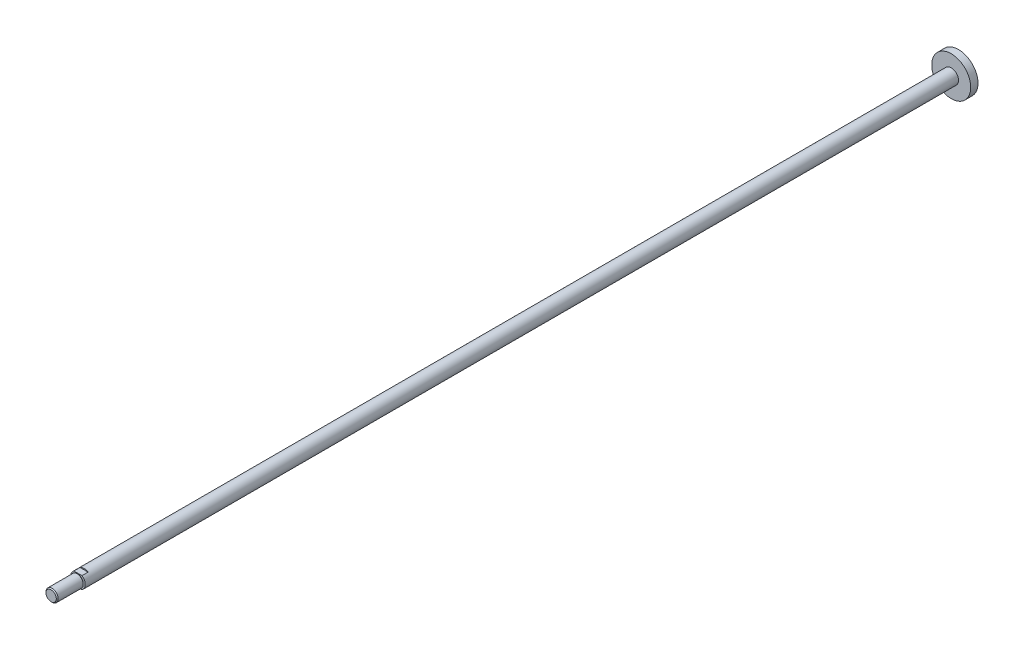
ISO-10303-21;
HEADER;
FILE_DESCRIPTION(('STEP AP214'),'2;1');
FILE_NAME('part.step','',(''),(''),'','','');
FILE_SCHEMA(('AUTOMOTIVE_DESIGN { 1 0 10303 214 1 1 1 1 }'));
ENDSEC;
DATA;
#1=APPLICATION_CONTEXT('core data for automotive mechanical design processes');
#2=APPLICATION_PROTOCOL_DEFINITION('international standard','automotive_design',2000,#1);
#3=PRODUCT_CONTEXT('',#1,'mechanical');
#4=PRODUCT('Part','Part','',(#3));
#5=PRODUCT_RELATED_PRODUCT_CATEGORY('part','',(#4));
#6=PRODUCT_DEFINITION_FORMATION('','',#4);
#7=PRODUCT_DEFINITION_CONTEXT('part definition',#1,'design');
#8=PRODUCT_DEFINITION('design','',#6,#7);
#9=PRODUCT_DEFINITION_SHAPE('','',#8);
#10=(LENGTH_UNIT() NAMED_UNIT(*) SI_UNIT(.MILLI.,.METRE.));
#11=(NAMED_UNIT(*) PLANE_ANGLE_UNIT() SI_UNIT($,.RADIAN.));
#12=(NAMED_UNIT(*) SI_UNIT($,.STERADIAN.) SOLID_ANGLE_UNIT());
#13=UNCERTAINTY_MEASURE_WITH_UNIT(LENGTH_MEASURE(1.E-05),#10,'distance_accuracy_value','');
#14=(GEOMETRIC_REPRESENTATION_CONTEXT(3) GLOBAL_UNCERTAINTY_ASSIGNED_CONTEXT((#13)) GLOBAL_UNIT_ASSIGNED_CONTEXT((#10,
#11,#12)) REPRESENTATION_CONTEXT('',''));
#15=CARTESIAN_POINT('',(0.,0.,0.));
#16=DIRECTION('',(0.,0.,1.));
#17=DIRECTION('',(1.,0.,0.));
#18=AXIS2_PLACEMENT_3D('',#15,#16,#17);
#19=CARTESIAN_POINT('',(0.,0.,745.));
#20=DIRECTION('',(0.,0.,-1.));
#21=DIRECTION('',(-1.,0.,0.));
#22=AXIS2_PLACEMENT_3D('',#19,#20,#21);
#23=PLANE('',#22);
#24=CARTESIAN_POINT('',(0.,0.,745.000000000005));
#25=DIRECTION('',(0.,0.,-1.));
#26=DIRECTION('',(-1.,0.,0.));
#27=AXIS2_PLACEMENT_3D('',#24,#25,#26);
#28=CIRCLE('',#27,4.23299999999927);
#29=CARTESIAN_POINT('',(-4.23299999999927,0.,745.000000000005));
#30=VERTEX_POINT('',#29);
#31=EDGE_CURVE('E20',#30,#30,#28,.T.);
#32=ORIENTED_EDGE('',*,*,#31,.F.);
#33=EDGE_LOOP('',(#32));
#34=FACE_BOUND('',#33,.T.);
#35=ADVANCED_FACE('F17',(#34),#23,.F.);
#36=CARTESIAN_POINT('',(0.,0.,744.233000000008));
#37=DIRECTION('',(0.,0.,-1.));
#38=DIRECTION('',(-1.,0.,0.));
#39=AXIS2_PLACEMENT_3D('',#36,#37,#38);
#40=CONICAL_SURFACE('',#39,4.99999999999545,0.785398163397448);
#41=ORIENTED_EDGE('',*,*,#31,.T.);
#42=EDGE_LOOP('',(#41));
#43=FACE_BOUND('',#42,.T.);
#44=CARTESIAN_POINT('',(0.,0.,744.233));
#45=DIRECTION('',(0.,0.,1.));
#46=DIRECTION('',(1.,0.,0.));
#47=AXIS2_PLACEMENT_3D('',#44,#45,#46);
#48=CIRCLE('',#47,5.);
#49=CARTESIAN_POINT('',(5.,0.,744.233));
#50=VERTEX_POINT('',#49);
#51=EDGE_CURVE('E98',#50,#50,#48,.F.);
#52=ORIENTED_EDGE('',*,*,#51,.F.);
#53=EDGE_LOOP('',(#52));
#54=FACE_BOUND('',#53,.T.);
#55=ADVANCED_FACE('F221',(#43,#54),#40,.T.);
#56=CARTESIAN_POINT('',(0.,16.,0.));
#57=DIRECTION('',(0.,0.,1.));
#58=DIRECTION('',(1.,0.,0.));
#59=AXIS2_PLACEMENT_3D('',#56,#57,#58);
#60=PLANE('',#59);
#61=CARTESIAN_POINT('',(0.,0.,0.));
#62=DIRECTION('',(0.,0.,1.));
#63=DIRECTION('',(1.,0.,0.));
#64=AXIS2_PLACEMENT_3D('',#61,#62,#63);
#65=CIRCLE('',#64,16.);
#66=CARTESIAN_POINT('',(16.,0.,0.));
#67=VERTEX_POINT('',#66);
#68=EDGE_CURVE('E96',#67,#67,#65,.T.);
#69=ORIENTED_EDGE('',*,*,#68,.F.);
#70=EDGE_LOOP('',(#69));
#71=FACE_BOUND('',#70,.T.);
#72=ADVANCED_FACE('F212',(#71),#60,.F.);
#73=CARTESIAN_POINT('',(0.,0.,722.9));
#74=DIRECTION('',(0.,0.,1.));
#75=DIRECTION('',(1.,0.,0.));
#76=AXIS2_PLACEMENT_3D('',#73,#74,#75);
#77=CYLINDRICAL_SURFACE('',#76,5.);
#78=ORIENTED_EDGE('',*,*,#51,.T.);
#79=EDGE_LOOP('',(#78));
#80=FACE_BOUND('',#79,.T.);
#81=CARTESIAN_POINT('',(0.,0.,723.666999999921));
#82=DIRECTION('',(0.,0.,1.));
#83=DIRECTION('',(1.,0.,0.));
#84=AXIS2_PLACEMENT_3D('',#81,#82,#83);
#85=CIRCLE('',#84,4.99999999999545);
#86=CARTESIAN_POINT('',(4.99999999999545,0.,723.666999999921));
#87=VERTEX_POINT('',#86);
#88=EDGE_CURVE('E95',#87,#87,#85,.F.);
#89=ORIENTED_EDGE('',*,*,#88,.F.);
#90=EDGE_LOOP('',(#89));
#91=FACE_BOUND('',#90,.T.);
#92=ADVANCED_FACE('F202',(#80,#91),#77,.T.);
#93=CARTESIAN_POINT('',(0.,0.,0.));
#94=DIRECTION('',(0.,0.,1.));
#95=DIRECTION('',(1.,0.,0.));
#96=AXIS2_PLACEMENT_3D('',#93,#94,#95);
#97=CYLINDRICAL_SURFACE('',#96,16.);
#98=CARTESIAN_POINT('',(0.,0.,6.));
#99=DIRECTION('',(0.,0.,1.));
#100=DIRECTION('',(1.,0.,0.));
#101=AXIS2_PLACEMENT_3D('',#98,#99,#100);
#102=CIRCLE('',#101,16.);
#103=CARTESIAN_POINT('',(16.,0.,6.));
#104=VERTEX_POINT('',#103);
#105=EDGE_CURVE('E93',#104,#104,#102,.F.);
#106=ORIENTED_EDGE('',*,*,#105,.T.);
#107=EDGE_LOOP('',(#106));
#108=FACE_BOUND('',#107,.T.);
#109=ORIENTED_EDGE('',*,*,#68,.T.);
#110=EDGE_LOOP('',(#109));
#111=FACE_BOUND('',#110,.T.);
#112=ADVANCED_FACE('F192',(#108,#111),#97,.T.);
#113=CARTESIAN_POINT('',(0.,0.,723.666999999864));
#114=DIRECTION('',(0.,0.,1.));
#115=DIRECTION('',(1.,0.,0.));
#116=AXIS2_PLACEMENT_3D('',#113,#114,#115);
#117=CONICAL_SURFACE('',#116,4.99999999993861,0.785398163397448);
#118=ORIENTED_EDGE('',*,*,#88,.T.);
#119=EDGE_LOOP('',(#118));
#120=FACE_BOUND('',#119,.T.);
#121=CARTESIAN_POINT('',(0.,0.,722.9999999999));
#122=DIRECTION('',(0.,0.,1.));
#123=DIRECTION('',(1.,0.,0.));
#124=AXIS2_PLACEMENT_3D('',#121,#122,#123);
#125=CIRCLE('',#124,4.33299999997416);
#126=CARTESIAN_POINT('',(4.33299999997416,0.,722.9999999999));
#127=VERTEX_POINT('',#126);
#128=EDGE_CURVE('E68',#127,#127,#125,.T.);
#129=ORIENTED_EDGE('',*,*,#128,.T.);
#130=EDGE_LOOP('',(#129));
#131=FACE_BOUND('',#130,.T.);
#132=ADVANCED_FACE('F182',(#120,#131),#117,.T.);
#133=CARTESIAN_POINT('',(0.,3.,6.));
#134=DIRECTION('',(0.,0.,-1.));
#135=DIRECTION('',(-1.,0.,0.));
#136=AXIS2_PLACEMENT_3D('',#133,#134,#135);
#137=PLANE('',#136);
#138=CARTESIAN_POINT('',(0.,0.,6.));
#139=DIRECTION('',(0.,0.,1.));
#140=DIRECTION('',(1.,0.,0.));
#141=AXIS2_PLACEMENT_3D('',#138,#139,#140);
#142=CIRCLE('',#141,6.);
#143=CARTESIAN_POINT('',(6.,0.,6.));
#144=VERTEX_POINT('',#143);
#145=EDGE_CURVE('E84',#144,#144,#142,.T.);
#146=ORIENTED_EDGE('',*,*,#145,.F.);
#147=EDGE_LOOP('',(#146));
#148=FACE_BOUND('',#147,.T.);
#149=ORIENTED_EDGE('',*,*,#105,.F.);
#150=EDGE_LOOP('',(#149));
#151=FACE_BOUND('',#150,.T.);
#152=ADVANCED_FACE('F172',(#148,#151),#137,.F.);
#153=CARTESIAN_POINT('',(0.,0.,718.));
#154=DIRECTION('',(0.,0.,1.));
#155=DIRECTION('',(1.,0.,0.));
#156=AXIS2_PLACEMENT_3D('',#153,#154,#155);
#157=PLANE('',#156);
#158=DIRECTION('',(1.,0.,0.));
#159=VECTOR('',#158,1.);
#160=CARTESIAN_POINT('',(-12.,5.,718.));
#161=LINE('',#160,#159);
#162=CARTESIAN_POINT('',(3.3166247903554,5.,718.));
#163=VERTEX_POINT('',#162);
#164=CARTESIAN_POINT('',(-3.3166247903554,5.,718.));
#165=VERTEX_POINT('',#164);
#166=EDGE_CURVE('E69',#163,#165,#161,.F.);
#167=ORIENTED_EDGE('',*,*,#166,.F.);
#168=CARTESIAN_POINT('',(0.,0.,718.));
#169=DIRECTION('',(0.,0.,1.));
#170=DIRECTION('',(1.,0.,0.));
#171=AXIS2_PLACEMENT_3D('',#168,#169,#170);
#172=CIRCLE('',#171,6.);
#173=EDGE_CURVE('E77',#165,#163,#172,.F.);
#174=ORIENTED_EDGE('',*,*,#173,.F.);
#175=EDGE_LOOP('',(#167,#174));
#176=FACE_BOUND('',#175,.T.);
#177=ADVANCED_FACE('F163',(#176),#157,.T.);
#178=CARTESIAN_POINT('',(-12.,5.,728.));
#179=DIRECTION('',(0.,1.,0.));
#180=DIRECTION('',(0.,0.,1.));
#181=AXIS2_PLACEMENT_3D('',#178,#179,#180);
#182=PLANE('',#181);
#183=DIRECTION('',(0.,0.,1.));
#184=VECTOR('',#183,1.);
#185=CARTESIAN_POINT('',(-3.3166247903554,5.,0.1));
#186=LINE('',#185,#184);
#187=CARTESIAN_POINT('',(-3.3166247903554,5.,723.));
#188=VERTEX_POINT('',#187);
#189=EDGE_CURVE('E72',#188,#165,#186,.F.);
#190=ORIENTED_EDGE('',*,*,#189,.F.);
#191=DIRECTION('',(-1.,0.,0.));
#192=VECTOR('',#191,1.);
#193=CARTESIAN_POINT('',(0.,5.,723.));
#194=LINE('',#193,#192);
#195=CARTESIAN_POINT('',(3.3166247903554,5.,723.));
#196=VERTEX_POINT('',#195);
#197=EDGE_CURVE('E57',#188,#196,#194,.F.);
#198=ORIENTED_EDGE('',*,*,#197,.T.);
#199=DIRECTION('',(0.,0.,1.));
#200=VECTOR('',#199,1.);
#201=CARTESIAN_POINT('',(3.3166247903554,5.,0.1));
#202=LINE('',#201,#200);
#203=EDGE_CURVE('E112',#163,#196,#202,.T.);
#204=ORIENTED_EDGE('',*,*,#203,.F.);
#205=ORIENTED_EDGE('',*,*,#166,.T.);
#206=EDGE_LOOP('',(#190,#198,#204,#205));
#207=FACE_BOUND('',#206,.T.);
#208=ADVANCED_FACE('F73',(#207),#182,.T.);
#209=CARTESIAN_POINT('',(0.,0.,723.));
#210=DIRECTION('',(0.,0.,-1.));
#211=DIRECTION('',(-1.,0.,0.));
#212=AXIS2_PLACEMENT_3D('',#209,#210,#211);
#213=PLANE('',#212);
#214=ORIENTED_EDGE('',*,*,#128,.F.);
#215=EDGE_LOOP('',(#214));
#216=FACE_BOUND('',#215,.T.);
#217=CARTESIAN_POINT('',(0.,0.,723.));
#218=DIRECTION('',(0.,0.,1.));
#219=DIRECTION('',(1.,0.,0.));
#220=AXIS2_PLACEMENT_3D('',#217,#218,#219);
#221=CIRCLE('',#220,6.);
#222=CARTESIAN_POINT('',(-3.3166247903554,-5.,723.));
#223=VERTEX_POINT('',#222);
#224=EDGE_CURVE('E61',#223,#188,#221,.F.);
#225=ORIENTED_EDGE('',*,*,#224,.F.);
#226=DIRECTION('',(1.,0.,0.));
#227=VECTOR('',#226,1.);
#228=CARTESIAN_POINT('',(12.,-5.,723.));
#229=LINE('',#228,#227);
#230=CARTESIAN_POINT('',(3.3166247903554,-5.,723.));
#231=VERTEX_POINT('',#230);
#232=EDGE_CURVE('E52',#231,#223,#229,.F.);
#233=ORIENTED_EDGE('',*,*,#232,.F.);
#234=CARTESIAN_POINT('',(0.,0.,723.));
#235=DIRECTION('',(0.,0.,1.));
#236=DIRECTION('',(1.,0.,0.));
#237=AXIS2_PLACEMENT_3D('',#234,#235,#236);
#238=CIRCLE('',#237,6.);
#239=EDGE_CURVE('E64',#196,#231,#238,.F.);
#240=ORIENTED_EDGE('',*,*,#239,.F.);
#241=ORIENTED_EDGE('',*,*,#197,.F.);
#242=EDGE_LOOP('',(#225,#233,#240,#241));
#243=FACE_BOUND('',#242,.T.);
#244=ADVANCED_FACE('F59',(#216,#243),#213,.F.);
#245=CARTESIAN_POINT('',(12.,-5.,728.));
#246=DIRECTION('',(0.,-1.,0.));
#247=DIRECTION('',(0.,0.,-1.));
#248=AXIS2_PLACEMENT_3D('',#245,#246,#247);
#249=PLANE('',#248);
#250=DIRECTION('',(0.,0.,1.));
#251=VECTOR('',#250,1.);
#252=CARTESIAN_POINT('',(3.3166247903554,-5.,0.1));
#253=LINE('',#252,#251);
#254=CARTESIAN_POINT('',(3.3166247903554,-5.,718.));
#255=VERTEX_POINT('',#254);
#256=EDGE_CURVE('E26',#231,#255,#253,.F.);
#257=ORIENTED_EDGE('',*,*,#256,.F.);
#258=ORIENTED_EDGE('',*,*,#232,.T.);
#259=DIRECTION('',(0.,0.,1.));
#260=VECTOR('',#259,1.);
#261=CARTESIAN_POINT('',(-3.3166247903554,-5.,0.1));
#262=LINE('',#261,#260);
#263=CARTESIAN_POINT('',(-3.3166247903554,-5.,718.));
#264=VERTEX_POINT('',#263);
#265=EDGE_CURVE('E82',#264,#223,#262,.T.);
#266=ORIENTED_EDGE('',*,*,#265,.F.);
#267=DIRECTION('',(1.,0.,0.));
#268=VECTOR('',#267,1.);
#269=CARTESIAN_POINT('',(0.,-5.,718.));
#270=LINE('',#269,#268);
#271=EDGE_CURVE('E35',#255,#264,#270,.F.);
#272=ORIENTED_EDGE('',*,*,#271,.F.);
#273=EDGE_LOOP('',(#257,#258,#266,#272));
#274=FACE_BOUND('',#273,.T.);
#275=ADVANCED_FACE('F120',(#274),#249,.T.);
#276=CARTESIAN_POINT('',(0.,0.,718.));
#277=DIRECTION('',(0.,0.,1.));
#278=DIRECTION('',(1.,0.,0.));
#279=AXIS2_PLACEMENT_3D('',#276,#277,#278);
#280=PLANE('',#279);
#281=CARTESIAN_POINT('',(0.,0.,718.));
#282=DIRECTION('',(0.,0.,1.));
#283=DIRECTION('',(1.,0.,0.));
#284=AXIS2_PLACEMENT_3D('',#281,#282,#283);
#285=CIRCLE('',#284,6.);
#286=EDGE_CURVE('E11',#255,#264,#285,.F.);
#287=ORIENTED_EDGE('',*,*,#286,.F.);
#288=ORIENTED_EDGE('',*,*,#271,.T.);
#289=EDGE_LOOP('',(#287,#288));
#290=FACE_BOUND('',#289,.T.);
#291=ADVANCED_FACE('F119',(#290),#280,.T.);
#292=CARTESIAN_POINT('',(0.,0.,0.1));
#293=DIRECTION('',(0.,0.,1.));
#294=DIRECTION('',(1.,0.,0.));
#295=AXIS2_PLACEMENT_3D('',#292,#293,#294);
#296=CYLINDRICAL_SURFACE('',#295,6.);
#297=ORIENTED_EDGE('',*,*,#256,.T.);
#298=ORIENTED_EDGE('',*,*,#286,.T.);
#299=ORIENTED_EDGE('',*,*,#265,.T.);
#300=ORIENTED_EDGE('',*,*,#224,.T.);
#301=ORIENTED_EDGE('',*,*,#189,.T.);
#302=ORIENTED_EDGE('',*,*,#173,.T.);
#303=ORIENTED_EDGE('',*,*,#203,.T.);
#304=ORIENTED_EDGE('',*,*,#239,.T.);
#305=EDGE_LOOP('',(#297,#298,#299,#300,#301,#302,#303,#304));
#306=FACE_BOUND('',#305,.T.);
#307=ORIENTED_EDGE('',*,*,#145,.T.);
#308=EDGE_LOOP('',(#307));
#309=FACE_BOUND('',#308,.T.);
#310=ADVANCED_FACE('F80',(#306,#309),#296,.T.);
#311=CLOSED_SHELL('',(#35,#55,#72,#92,#112,#132,#152,#177,#208,#244,#275,#291,#310));
#312=MANIFOLD_SOLID_BREP('B1',#311);
#313=ADVANCED_BREP_SHAPE_REPRESENTATION('',(#18,#312),#14);
#314=SHAPE_DEFINITION_REPRESENTATION(#9,#313);
ENDSEC;
END-ISO-10303-21;
